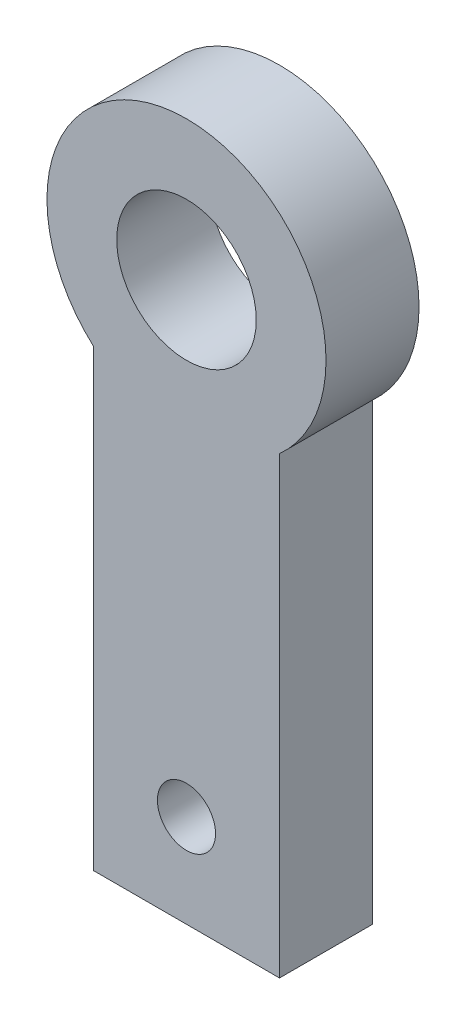
ISO-10303-21;
HEADER;
FILE_DESCRIPTION(('STEP AP214'),'2;1');
FILE_NAME('part.step','',(''),(''),'','','');
FILE_SCHEMA(('AUTOMOTIVE_DESIGN { 1 0 10303 214 1 1 1 1 }'));
ENDSEC;
DATA;
#1=APPLICATION_CONTEXT('core data for automotive mechanical design processes');
#2=APPLICATION_PROTOCOL_DEFINITION('international standard','automotive_design',2000,#1);
#3=PRODUCT_CONTEXT('',#1,'mechanical');
#4=PRODUCT('Part','Part','',(#3));
#5=PRODUCT_RELATED_PRODUCT_CATEGORY('part','',(#4));
#6=PRODUCT_DEFINITION_FORMATION('','',#4);
#7=PRODUCT_DEFINITION_CONTEXT('part definition',#1,'design');
#8=PRODUCT_DEFINITION('design','',#6,#7);
#9=PRODUCT_DEFINITION_SHAPE('','',#8);
#10=(LENGTH_UNIT() NAMED_UNIT(*) SI_UNIT(.MILLI.,.METRE.));
#11=(NAMED_UNIT(*) PLANE_ANGLE_UNIT() SI_UNIT($,.RADIAN.));
#12=(NAMED_UNIT(*) SI_UNIT($,.STERADIAN.) SOLID_ANGLE_UNIT());
#13=UNCERTAINTY_MEASURE_WITH_UNIT(LENGTH_MEASURE(1.E-05),#10,'distance_accuracy_value','');
#14=(GEOMETRIC_REPRESENTATION_CONTEXT(3) GLOBAL_UNCERTAINTY_ASSIGNED_CONTEXT((#13)) GLOBAL_UNIT_ASSIGNED_CONTEXT((#10,
#11,#12)) REPRESENTATION_CONTEXT('',''));
#15=CARTESIAN_POINT('',(0.,0.,0.));
#16=DIRECTION('',(0.,0.,1.));
#17=DIRECTION('',(1.,0.,0.));
#18=AXIS2_PLACEMENT_3D('',#15,#16,#17);
#19=CARTESIAN_POINT('',(-95.,83.4,17.2));
#20=DIRECTION('',(1.,0.,0.));
#21=DIRECTION('',(0.,0.,-1.));
#22=AXIS2_PLACEMENT_3D('',#19,#20,#21);
#23=PLANE('',#22);
#24=DIRECTION('',(0.,0.,-1.));
#25=VECTOR('',#24,1.);
#26=CARTESIAN_POINT('',(-95.,78.9278640450004,17.2));
#27=LINE('',#26,#25);
#28=CARTESIAN_POINT('',(-95.,78.9278640450004,13.2));
#29=VERTEX_POINT('',#28);
#30=CARTESIAN_POINT('',(-95.,78.9278640450004,17.2));
#31=VERTEX_POINT('',#30);
#32=EDGE_CURVE('E97',#29,#31,#27,.F.);
#33=ORIENTED_EDGE('',*,*,#32,.F.);
#34=DIRECTION('',(0.,-1.,0.));
#35=VECTOR('',#34,1.);
#36=CARTESIAN_POINT('',(-95.,83.4,13.2));
#37=LINE('',#36,#35);
#38=CARTESIAN_POINT('',(-95.,59.4,13.2));
#39=VERTEX_POINT('',#38);
#40=EDGE_CURVE('E95',#29,#39,#37,.T.);
#41=ORIENTED_EDGE('',*,*,#40,.T.);
#42=DIRECTION('',(0.,0.,-1.));
#43=VECTOR('',#42,1.);
#44=CARTESIAN_POINT('',(-95.,59.4,17.2));
#45=LINE('',#44,#43);
#46=CARTESIAN_POINT('',(-95.,59.4,17.2));
#47=VERTEX_POINT('',#46);
#48=EDGE_CURVE('E11',#47,#39,#45,.T.);
#49=ORIENTED_EDGE('',*,*,#48,.F.);
#50=DIRECTION('',(0.,-1.,0.));
#51=VECTOR('',#50,1.);
#52=CARTESIAN_POINT('',(-95.,83.4,17.2));
#53=LINE('',#52,#51);
#54=EDGE_CURVE('E64',#31,#47,#53,.T.);
#55=ORIENTED_EDGE('',*,*,#54,.F.);
#56=EDGE_LOOP('',(#33,#41,#49,#55));
#57=FACE_BOUND('',#56,.T.);
#58=ADVANCED_FACE('F41',(#57),#23,.F.);
#59=CARTESIAN_POINT('',(-87.,59.4,17.2));
#60=DIRECTION('',(-1.,0.,0.));
#61=DIRECTION('',(0.,0.,1.));
#62=AXIS2_PLACEMENT_3D('',#59,#60,#61);
#63=PLANE('',#62);
#64=DIRECTION('',(0.,0.,-1.));
#65=VECTOR('',#64,1.);
#66=CARTESIAN_POINT('',(-87.,78.9278640450004,17.2));
#67=LINE('',#66,#65);
#68=CARTESIAN_POINT('',(-87.,78.9278640450004,17.2));
#69=VERTEX_POINT('',#68);
#70=CARTESIAN_POINT('',(-87.,78.9278640450004,13.2));
#71=VERTEX_POINT('',#70);
#72=EDGE_CURVE('E54',#69,#71,#67,.T.);
#73=ORIENTED_EDGE('',*,*,#72,.F.);
#74=DIRECTION('',(0.,1.,0.));
#75=VECTOR('',#74,1.);
#76=CARTESIAN_POINT('',(-87.,59.4,17.2));
#77=LINE('',#76,#75);
#78=CARTESIAN_POINT('',(-87.,59.4,17.2));
#79=VERTEX_POINT('',#78);
#80=EDGE_CURVE('E92',#79,#69,#77,.T.);
#81=ORIENTED_EDGE('',*,*,#80,.F.);
#82=DIRECTION('',(0.,0.,-1.));
#83=VECTOR('',#82,1.);
#84=CARTESIAN_POINT('',(-87.,59.4,17.2));
#85=LINE('',#84,#83);
#86=CARTESIAN_POINT('',(-87.,59.4,13.2));
#87=VERTEX_POINT('',#86);
#88=EDGE_CURVE('E48',#79,#87,#85,.T.);
#89=ORIENTED_EDGE('',*,*,#88,.T.);
#90=DIRECTION('',(0.,1.,0.));
#91=VECTOR('',#90,1.);
#92=CARTESIAN_POINT('',(-87.,59.4,13.2));
#93=LINE('',#92,#91);
#94=EDGE_CURVE('E90',#87,#71,#93,.T.);
#95=ORIENTED_EDGE('',*,*,#94,.T.);
#96=EDGE_LOOP('',(#73,#81,#89,#95));
#97=FACE_BOUND('',#96,.T.);
#98=ADVANCED_FACE('F152',(#97),#63,.F.);
#99=CARTESIAN_POINT('',(-95.,59.4,17.2));
#100=DIRECTION('',(0.,1.,0.));
#101=DIRECTION('',(0.,0.,1.));
#102=AXIS2_PLACEMENT_3D('',#99,#100,#101);
#103=PLANE('',#102);
#104=DIRECTION('',(1.,0.,0.));
#105=VECTOR('',#104,1.);
#106=CARTESIAN_POINT('',(-95.,59.4,13.2));
#107=LINE('',#106,#105);
#108=EDGE_CURVE('E103',#39,#87,#107,.T.);
#109=ORIENTED_EDGE('',*,*,#108,.T.);
#110=ORIENTED_EDGE('',*,*,#88,.F.);
#111=DIRECTION('',(1.,0.,0.));
#112=VECTOR('',#111,1.);
#113=CARTESIAN_POINT('',(-95.,59.4,17.2));
#114=LINE('',#113,#112);
#115=EDGE_CURVE('E84',#47,#79,#114,.T.);
#116=ORIENTED_EDGE('',*,*,#115,.F.);
#117=ORIENTED_EDGE('',*,*,#48,.T.);
#118=EDGE_LOOP('',(#109,#110,#116,#117));
#119=FACE_BOUND('',#118,.T.);
#120=ADVANCED_FACE('F89',(#119),#103,.F.);
#121=CARTESIAN_POINT('',(0.,0.,17.2));
#122=DIRECTION('',(0.,0.,1.));
#123=DIRECTION('',(1.,0.,0.));
#124=AXIS2_PLACEMENT_3D('',#121,#122,#123);
#125=PLANE('',#124);
#126=CARTESIAN_POINT('',(-91.,63.4,17.2));
#127=DIRECTION('',(0.,0.,1.));
#128=DIRECTION('',(1.,0.,0.));
#129=AXIS2_PLACEMENT_3D('',#126,#127,#128);
#130=CIRCLE('',#129,1.25);
#131=CARTESIAN_POINT('',(-89.75,63.4,17.2));
#132=VERTEX_POINT('',#131);
#133=EDGE_CURVE('E117',#132,#132,#130,.T.);
#134=ORIENTED_EDGE('',*,*,#133,.F.);
#135=EDGE_LOOP('',(#134));
#136=FACE_BOUND('',#135,.T.);
#137=CARTESIAN_POINT('',(-91.,83.4,17.2));
#138=DIRECTION('',(0.,0.,1.));
#139=DIRECTION('',(1.,0.,0.));
#140=AXIS2_PLACEMENT_3D('',#137,#138,#139);
#141=CIRCLE('',#140,3.);
#142=CARTESIAN_POINT('',(-88.,83.4,17.2));
#143=VERTEX_POINT('',#142);
#144=EDGE_CURVE('E113',#143,#143,#141,.T.);
#145=ORIENTED_EDGE('',*,*,#144,.F.);
#146=EDGE_LOOP('',(#145));
#147=FACE_BOUND('',#146,.T.);
#148=CARTESIAN_POINT('',(-91.,83.4,17.2));
#149=DIRECTION('',(0.,0.,1.));
#150=DIRECTION('',(1.,0.,0.));
#151=AXIS2_PLACEMENT_3D('',#148,#149,#150);
#152=CIRCLE('',#151,6.00000000000001);
#153=EDGE_CURVE('E86',#69,#31,#152,.T.);
#154=ORIENTED_EDGE('',*,*,#153,.T.);
#155=ORIENTED_EDGE('',*,*,#54,.T.);
#156=ORIENTED_EDGE('',*,*,#115,.T.);
#157=ORIENTED_EDGE('',*,*,#80,.T.);
#158=EDGE_LOOP('',(#154,#155,#156,#157));
#159=FACE_BOUND('',#158,.T.);
#160=ADVANCED_FACE('F85',(#136,#147,#159),#125,.T.);
#161=CARTESIAN_POINT('',(0.,0.,13.2));
#162=DIRECTION('',(0.,0.,1.));
#163=DIRECTION('',(1.,0.,0.));
#164=AXIS2_PLACEMENT_3D('',#161,#162,#163);
#165=PLANE('',#164);
#166=CARTESIAN_POINT('',(-91.,63.4,13.2));
#167=DIRECTION('',(0.,0.,1.));
#168=DIRECTION('',(1.,0.,0.));
#169=AXIS2_PLACEMENT_3D('',#166,#167,#168);
#170=CIRCLE('',#169,1.25);
#171=CARTESIAN_POINT('',(-89.75,63.4,13.2));
#172=VERTEX_POINT('',#171);
#173=EDGE_CURVE('E122',#172,#172,#170,.T.);
#174=ORIENTED_EDGE('',*,*,#173,.T.);
#175=EDGE_LOOP('',(#174));
#176=FACE_BOUND('',#175,.T.);
#177=CARTESIAN_POINT('',(-91.,83.4,13.2));
#178=DIRECTION('',(0.,0.,1.));
#179=DIRECTION('',(1.,0.,0.));
#180=AXIS2_PLACEMENT_3D('',#177,#178,#179);
#181=CIRCLE('',#180,3.);
#182=CARTESIAN_POINT('',(-88.,83.4,13.2));
#183=VERTEX_POINT('',#182);
#184=EDGE_CURVE('E114',#183,#183,#181,.T.);
#185=ORIENTED_EDGE('',*,*,#184,.T.);
#186=EDGE_LOOP('',(#185));
#187=FACE_BOUND('',#186,.T.);
#188=ORIENTED_EDGE('',*,*,#40,.F.);
#189=CARTESIAN_POINT('',(-91.,83.4,13.2));
#190=DIRECTION('',(0.,0.,1.));
#191=DIRECTION('',(1.,0.,0.));
#192=AXIS2_PLACEMENT_3D('',#189,#190,#191);
#193=CIRCLE('',#192,6.00000000000001);
#194=EDGE_CURVE('E111',#71,#29,#193,.T.);
#195=ORIENTED_EDGE('',*,*,#194,.F.);
#196=ORIENTED_EDGE('',*,*,#94,.F.);
#197=ORIENTED_EDGE('',*,*,#108,.F.);
#198=EDGE_LOOP('',(#188,#195,#196,#197));
#199=FACE_BOUND('',#198,.T.);
#200=ADVANCED_FACE('F104',(#176,#187,#199),#165,.F.);
#201=CARTESIAN_POINT('',(-91.,83.4,17.2));
#202=DIRECTION('',(0.,0.,-1.));
#203=DIRECTION('',(-1.,0.,0.));
#204=AXIS2_PLACEMENT_3D('',#201,#202,#203);
#205=CYLINDRICAL_SURFACE('',#204,6.00000000000001);
#206=ORIENTED_EDGE('',*,*,#194,.T.);
#207=ORIENTED_EDGE('',*,*,#32,.T.);
#208=ORIENTED_EDGE('',*,*,#153,.F.);
#209=ORIENTED_EDGE('',*,*,#72,.T.);
#210=EDGE_LOOP('',(#206,#207,#208,#209));
#211=FACE_BOUND('',#210,.T.);
#212=ADVANCED_FACE('F139',(#211),#205,.T.);
#213=CARTESIAN_POINT('',(-91.,83.4,17.2));
#214=DIRECTION('',(0.,0.,-1.));
#215=DIRECTION('',(-1.,0.,0.));
#216=AXIS2_PLACEMENT_3D('',#213,#214,#215);
#217=CYLINDRICAL_SURFACE('',#216,3.);
#218=ORIENTED_EDGE('',*,*,#144,.T.);
#219=EDGE_LOOP('',(#218));
#220=FACE_BOUND('',#219,.T.);
#221=ORIENTED_EDGE('',*,*,#184,.F.);
#222=EDGE_LOOP('',(#221));
#223=FACE_BOUND('',#222,.T.);
#224=ADVANCED_FACE('F134',(#220,#223),#217,.F.);
#225=CARTESIAN_POINT('',(-91.,63.4,17.2));
#226=DIRECTION('',(0.,0.,-1.));
#227=DIRECTION('',(-1.,0.,0.));
#228=AXIS2_PLACEMENT_3D('',#225,#226,#227);
#229=CYLINDRICAL_SURFACE('',#228,1.25);
#230=ORIENTED_EDGE('',*,*,#133,.T.);
#231=EDGE_LOOP('',(#230));
#232=FACE_BOUND('',#231,.T.);
#233=ORIENTED_EDGE('',*,*,#173,.F.);
#234=EDGE_LOOP('',(#233));
#235=FACE_BOUND('',#234,.T.);
#236=ADVANCED_FACE('F130',(#232,#235),#229,.F.);
#237=CLOSED_SHELL('',(#58,#98,#120,#160,#200,#212,#224,#236));
#238=MANIFOLD_SOLID_BREP('B2',#237);
#239=ADVANCED_BREP_SHAPE_REPRESENTATION('',(#18,#238),#14);
#240=SHAPE_DEFINITION_REPRESENTATION(#9,#239);
ENDSEC;
END-ISO-10303-21;
